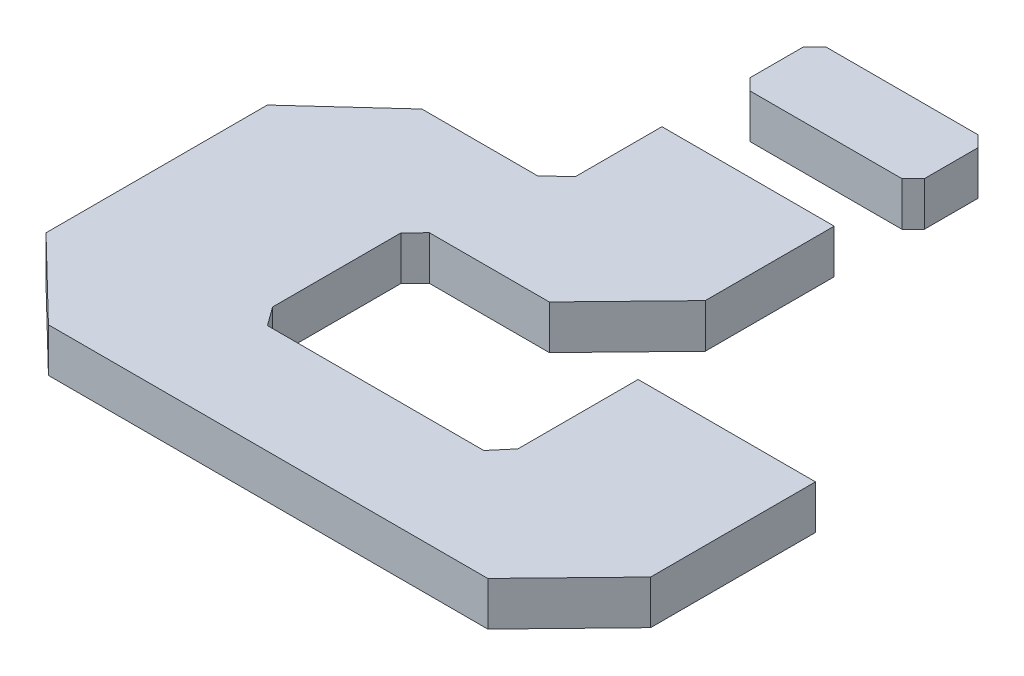
ISO-10303-21;
HEADER;
FILE_DESCRIPTION(('STEP AP214'),'2;1');
FILE_NAME('part.step','',(''),(''),'','','');
FILE_SCHEMA(('AUTOMOTIVE_DESIGN { 1 0 10303 214 1 1 1 1 }'));
ENDSEC;
DATA;
#1=APPLICATION_CONTEXT('core data for automotive mechanical design processes');
#2=APPLICATION_PROTOCOL_DEFINITION('international standard','automotive_design',2000,#1);
#3=PRODUCT_CONTEXT('',#1,'mechanical');
#4=PRODUCT('Part','Part','',(#3));
#5=PRODUCT_RELATED_PRODUCT_CATEGORY('part','',(#4));
#6=PRODUCT_DEFINITION_FORMATION('','',#4);
#7=PRODUCT_DEFINITION_CONTEXT('part definition',#1,'design');
#8=PRODUCT_DEFINITION('design','',#6,#7);
#9=PRODUCT_DEFINITION_SHAPE('','',#8);
#10=(LENGTH_UNIT() NAMED_UNIT(*) SI_UNIT(.MILLI.,.METRE.));
#11=(NAMED_UNIT(*) PLANE_ANGLE_UNIT() SI_UNIT($,.RADIAN.));
#12=(NAMED_UNIT(*) SI_UNIT($,.STERADIAN.) SOLID_ANGLE_UNIT());
#13=UNCERTAINTY_MEASURE_WITH_UNIT(LENGTH_MEASURE(1.E-05),#10,'distance_accuracy_value','');
#14=(GEOMETRIC_REPRESENTATION_CONTEXT(3) GLOBAL_UNCERTAINTY_ASSIGNED_CONTEXT((#13)) GLOBAL_UNIT_ASSIGNED_CONTEXT((#10,
#11,#12)) REPRESENTATION_CONTEXT('',''));
#15=CARTESIAN_POINT('',(0.,0.,0.));
#16=DIRECTION('',(0.,0.,1.));
#17=DIRECTION('',(1.,0.,0.));
#18=AXIS2_PLACEMENT_3D('',#15,#16,#17);
#19=CARTESIAN_POINT('',(10.6393932182767,3.,-13.1965444015863));
#20=DIRECTION('',(0.,0.,-1.));
#21=DIRECTION('',(-1.,0.,0.));
#22=AXIS2_PLACEMENT_3D('',#19,#20,#21);
#23=PLANE('',#22);
#24=DIRECTION('',(1.,0.,0.));
#25=VECTOR('',#24,1.);
#26=CARTESIAN_POINT('',(10.6393932182767,0.,-13.1965444015863));
#27=LINE('',#26,#25);
#28=CARTESIAN_POINT('',(0.23435597339086,0.,-13.1965444015863));
#29=VERTEX_POINT('',#28);
#30=CARTESIAN_POINT('',(10.6393932182767,0.,-13.1965444015863));
#31=VERTEX_POINT('',#30);
#32=EDGE_CURVE('E141',#29,#31,#27,.T.);
#33=ORIENTED_EDGE('',*,*,#32,.T.);
#34=DIRECTION('',(0.,-1.,0.));
#35=VECTOR('',#34,1.);
#36=CARTESIAN_POINT('',(10.6393932182767,3.,-13.1965444015863));
#37=LINE('',#36,#35);
#38=CARTESIAN_POINT('',(10.6393932182767,3.,-13.1965444015863));
#39=VERTEX_POINT('',#38);
#40=EDGE_CURVE('E12',#39,#31,#37,.T.);
#41=ORIENTED_EDGE('',*,*,#40,.F.);
#42=DIRECTION('',(1.,0.,0.));
#43=VECTOR('',#42,1.);
#44=CARTESIAN_POINT('',(10.6393932182767,3.,-13.1965444015863));
#45=LINE('',#44,#43);
#46=CARTESIAN_POINT('',(0.23435597339086,3.,-13.1965444015863));
#47=VERTEX_POINT('',#46);
#48=EDGE_CURVE('E155',#47,#39,#45,.T.);
#49=ORIENTED_EDGE('',*,*,#48,.F.);
#50=DIRECTION('',(0.,-1.,0.));
#51=VECTOR('',#50,1.);
#52=CARTESIAN_POINT('',(0.23435597339086,3.,-13.1965444015863));
#53=LINE('',#52,#51);
#54=EDGE_CURVE('E137',#47,#29,#53,.T.);
#55=ORIENTED_EDGE('',*,*,#54,.T.);
#56=EDGE_LOOP('',(#33,#41,#49,#55));
#57=FACE_BOUND('',#56,.T.);
#58=ADVANCED_FACE('F45',(#57),#23,.F.);
#59=CARTESIAN_POINT('',(10.6393932182767,3.,-13.1965444015863));
#60=DIRECTION('',(-0.707106781186548,0.,-0.707106781186548));
#61=DIRECTION('',(-0.707106781186548,0.,0.707106781186548));
#62=AXIS2_PLACEMENT_3D('',#59,#60,#61);
#63=PLANE('',#62);
#64=DIRECTION('',(0.707106781186547,0.,-0.707106781186547));
#65=VECTOR('',#64,1.);
#66=CARTESIAN_POINT('',(10.6393932182767,0.,-13.1965444015863));
#67=LINE('',#66,#65);
#68=CARTESIAN_POINT('',(11.405078643226,0.,-13.9622298265356));
#69=VERTEX_POINT('',#68);
#70=EDGE_CURVE('E144',#31,#69,#67,.T.);
#71=ORIENTED_EDGE('',*,*,#70,.T.);
#72=DIRECTION('',(0.,-1.,0.));
#73=VECTOR('',#72,1.);
#74=CARTESIAN_POINT('',(11.405078643226,3.,-13.9622298265356));
#75=LINE('',#74,#73);
#76=CARTESIAN_POINT('',(11.405078643226,3.,-13.9622298265356));
#77=VERTEX_POINT('',#76);
#78=EDGE_CURVE('E53',#77,#69,#75,.T.);
#79=ORIENTED_EDGE('',*,*,#78,.F.);
#80=DIRECTION('',(0.707106781186547,0.,-0.707106781186547));
#81=VECTOR('',#80,1.);
#82=CARTESIAN_POINT('',(10.6393932182767,3.,-13.1965444015863));
#83=LINE('',#82,#81);
#84=EDGE_CURVE('E104',#39,#77,#83,.T.);
#85=ORIENTED_EDGE('',*,*,#84,.F.);
#86=ORIENTED_EDGE('',*,*,#40,.T.);
#87=EDGE_LOOP('',(#71,#79,#85,#86));
#88=FACE_BOUND('',#87,.T.);
#89=ADVANCED_FACE('F190',(#88),#63,.F.);
#90=CARTESIAN_POINT('',(11.405078643226,3.,-13.9622298265356));
#91=DIRECTION('',(-1.,0.,0.));
#92=DIRECTION('',(0.,0.,1.));
#93=AXIS2_PLACEMENT_3D('',#90,#91,#92);
#94=PLANE('',#93);
#95=DIRECTION('',(0.,0.,-1.));
#96=VECTOR('',#95,1.);
#97=CARTESIAN_POINT('',(11.405078643226,0.,-13.9622298265356));
#98=LINE('',#97,#96);
#99=CARTESIAN_POINT('',(11.405078643226,0.,-17.6308589766371));
#100=VERTEX_POINT('',#99);
#101=EDGE_CURVE('E146',#69,#100,#98,.T.);
#102=ORIENTED_EDGE('',*,*,#101,.T.);
#103=DIRECTION('',(0.,-1.,0.));
#104=VECTOR('',#103,1.);
#105=CARTESIAN_POINT('',(11.405078643226,3.,-17.6308589766371));
#106=LINE('',#105,#104);
#107=CARTESIAN_POINT('',(11.405078643226,3.,-17.6308589766371));
#108=VERTEX_POINT('',#107);
#109=EDGE_CURVE('E162',#108,#100,#106,.T.);
#110=ORIENTED_EDGE('',*,*,#109,.F.);
#111=DIRECTION('',(0.,0.,-1.));
#112=VECTOR('',#111,1.);
#113=CARTESIAN_POINT('',(11.405078643226,3.,-13.9622298265356));
#114=LINE('',#113,#112);
#115=EDGE_CURVE('E170',#77,#108,#114,.T.);
#116=ORIENTED_EDGE('',*,*,#115,.F.);
#117=ORIENTED_EDGE('',*,*,#78,.T.);
#118=EDGE_LOOP('',(#102,#110,#116,#117));
#119=FACE_BOUND('',#118,.T.);
#120=ADVANCED_FACE('F168',(#119),#94,.F.);
#121=CARTESIAN_POINT('',(11.405078643226,3.,-17.6308589766371));
#122=DIRECTION('',(-0.707106781186548,0.,0.707106781186548));
#123=DIRECTION('',(0.707106781186548,0.,0.707106781186548));
#124=AXIS2_PLACEMENT_3D('',#121,#122,#123);
#125=PLANE('',#124);
#126=DIRECTION('',(-0.707106781186547,0.,-0.707106781186547));
#127=VECTOR('',#126,1.);
#128=CARTESIAN_POINT('',(11.405078643226,0.,-17.6308589766371));
#129=LINE('',#128,#127);
#130=CARTESIAN_POINT('',(10.6393932182767,0.,-18.3965444015863));
#131=VERTEX_POINT('',#130);
#132=EDGE_CURVE('E148',#100,#131,#129,.T.);
#133=ORIENTED_EDGE('',*,*,#132,.T.);
#134=DIRECTION('',(0.,-1.,0.));
#135=VECTOR('',#134,1.);
#136=CARTESIAN_POINT('',(10.6393932182767,3.,-18.3965444015863));
#137=LINE('',#136,#135);
#138=CARTESIAN_POINT('',(10.6393932182767,3.,-18.3965444015863));
#139=VERTEX_POINT('',#138);
#140=EDGE_CURVE('E159',#139,#131,#137,.T.);
#141=ORIENTED_EDGE('',*,*,#140,.F.);
#142=DIRECTION('',(-0.707106781186547,0.,-0.707106781186547));
#143=VECTOR('',#142,1.);
#144=CARTESIAN_POINT('',(11.405078643226,3.,-17.6308589766371));
#145=LINE('',#144,#143);
#146=EDGE_CURVE('E182',#108,#139,#145,.T.);
#147=ORIENTED_EDGE('',*,*,#146,.F.);
#148=ORIENTED_EDGE('',*,*,#109,.T.);
#149=EDGE_LOOP('',(#133,#141,#147,#148));
#150=FACE_BOUND('',#149,.T.);
#151=ADVANCED_FACE('F178',(#150),#125,.F.);
#152=CARTESIAN_POINT('',(10.6393932182767,3.,-18.3965444015863));
#153=DIRECTION('',(0.,0.,1.));
#154=DIRECTION('',(1.,0.,0.));
#155=AXIS2_PLACEMENT_3D('',#152,#153,#154);
#156=PLANE('',#155);
#157=DIRECTION('',(-1.,0.,0.));
#158=VECTOR('',#157,1.);
#159=CARTESIAN_POINT('',(10.6393932182767,0.,-18.3965444015863));
#160=LINE('',#159,#158);
#161=CARTESIAN_POINT('',(0.234355973390866,0.,-18.3965444015863));
#162=VERTEX_POINT('',#161);
#163=EDGE_CURVE('E150',#131,#162,#160,.T.);
#164=ORIENTED_EDGE('',*,*,#163,.T.);
#165=DIRECTION('',(0.,-1.,0.));
#166=VECTOR('',#165,1.);
#167=CARTESIAN_POINT('',(0.234355973390866,3.,-18.3965444015863));
#168=LINE('',#167,#166);
#169=CARTESIAN_POINT('',(0.234355973390866,3.,-18.3965444015863));
#170=VERTEX_POINT('',#169);
#171=EDGE_CURVE('E132',#170,#162,#168,.T.);
#172=ORIENTED_EDGE('',*,*,#171,.F.);
#173=DIRECTION('',(-1.,0.,0.));
#174=VECTOR('',#173,1.);
#175=CARTESIAN_POINT('',(10.6393932182767,3.,-18.3965444015863));
#176=LINE('',#175,#174);
#177=EDGE_CURVE('E123',#139,#170,#176,.T.);
#178=ORIENTED_EDGE('',*,*,#177,.F.);
#179=ORIENTED_EDGE('',*,*,#140,.T.);
#180=EDGE_LOOP('',(#164,#172,#178,#179));
#181=FACE_BOUND('',#180,.T.);
#182=ADVANCED_FACE('F181',(#181),#156,.F.);
#183=CARTESIAN_POINT('',(-0.531329451558372,3.,-17.6308589766371));
#184=DIRECTION('',(0.707106781186547,0.,0.707106781186548));
#185=DIRECTION('',(0.707106781186548,0.,-0.707106781186547));
#186=AXIS2_PLACEMENT_3D('',#183,#184,#185);
#187=PLANE('',#186);
#188=DIRECTION('',(-0.707106781186548,0.,0.707106781186547));
#189=VECTOR('',#188,1.);
#190=CARTESIAN_POINT('',(-0.531329451558372,0.,-17.6308589766371));
#191=LINE('',#190,#189);
#192=CARTESIAN_POINT('',(-0.531329451558372,0.,-17.6308589766371));
#193=VERTEX_POINT('',#192);
#194=EDGE_CURVE('E131',#162,#193,#191,.T.);
#195=ORIENTED_EDGE('',*,*,#194,.T.);
#196=DIRECTION('',(0.,-1.,0.));
#197=VECTOR('',#196,1.);
#198=CARTESIAN_POINT('',(-0.531329451558372,3.,-17.6308589766371));
#199=LINE('',#198,#197);
#200=CARTESIAN_POINT('',(-0.531329451558372,3.,-17.6308589766371));
#201=VERTEX_POINT('',#200);
#202=EDGE_CURVE('E128',#201,#193,#199,.T.);
#203=ORIENTED_EDGE('',*,*,#202,.F.);
#204=DIRECTION('',(-0.707106781186548,0.,0.707106781186547));
#205=VECTOR('',#204,1.);
#206=CARTESIAN_POINT('',(-0.531329451558372,3.,-17.6308589766371));
#207=LINE('',#206,#205);
#208=EDGE_CURVE('E117',#170,#201,#207,.T.);
#209=ORIENTED_EDGE('',*,*,#208,.F.);
#210=ORIENTED_EDGE('',*,*,#171,.T.);
#211=EDGE_LOOP('',(#195,#203,#209,#210));
#212=FACE_BOUND('',#211,.T.);
#213=ADVANCED_FACE('F129',(#212),#187,.F.);
#214=CARTESIAN_POINT('',(-0.531329451558372,3.,-13.9622298265356));
#215=DIRECTION('',(1.,0.,0.));
#216=DIRECTION('',(0.,0.,-1.));
#217=AXIS2_PLACEMENT_3D('',#214,#215,#216);
#218=PLANE('',#217);
#219=DIRECTION('',(0.,0.,1.));
#220=VECTOR('',#219,1.);
#221=CARTESIAN_POINT('',(-0.531329451558372,0.,-13.9622298265356));
#222=LINE('',#221,#220);
#223=CARTESIAN_POINT('',(-0.531329451558372,0.,-13.9622298265356));
#224=VERTEX_POINT('',#223);
#225=EDGE_CURVE('E90',#193,#224,#222,.T.);
#226=ORIENTED_EDGE('',*,*,#225,.T.);
#227=DIRECTION('',(0.,-1.,0.));
#228=VECTOR('',#227,1.);
#229=CARTESIAN_POINT('',(-0.531329451558372,3.,-13.9622298265356));
#230=LINE('',#229,#228);
#231=CARTESIAN_POINT('',(-0.531329451558372,3.,-13.9622298265356));
#232=VERTEX_POINT('',#231);
#233=EDGE_CURVE('E133',#232,#224,#230,.T.);
#234=ORIENTED_EDGE('',*,*,#233,.F.);
#235=DIRECTION('',(0.,0.,1.));
#236=VECTOR('',#235,1.);
#237=CARTESIAN_POINT('',(-0.531329451558372,3.,-13.9622298265356));
#238=LINE('',#237,#236);
#239=EDGE_CURVE('E121',#201,#232,#238,.T.);
#240=ORIENTED_EDGE('',*,*,#239,.F.);
#241=ORIENTED_EDGE('',*,*,#202,.T.);
#242=EDGE_LOOP('',(#226,#234,#240,#241));
#243=FACE_BOUND('',#242,.T.);
#244=ADVANCED_FACE('F135',(#243),#218,.F.);
#245=CARTESIAN_POINT('',(0.23435597339086,3.,-13.1965444015863));
#246=DIRECTION('',(0.707106781186548,0.,-0.707106781186547));
#247=DIRECTION('',(-0.707106781186547,0.,-0.707106781186548));
#248=AXIS2_PLACEMENT_3D('',#245,#246,#247);
#249=PLANE('',#248);
#250=DIRECTION('',(0.707106781186547,0.,0.707106781186548));
#251=VECTOR('',#250,1.);
#252=CARTESIAN_POINT('',(0.23435597339086,0.,-13.1965444015863));
#253=LINE('',#252,#251);
#254=EDGE_CURVE('E96',#224,#29,#253,.T.);
#255=ORIENTED_EDGE('',*,*,#254,.T.);
#256=ORIENTED_EDGE('',*,*,#54,.F.);
#257=DIRECTION('',(0.707106781186547,0.,0.707106781186548));
#258=VECTOR('',#257,1.);
#259=CARTESIAN_POINT('',(0.23435597339086,3.,-13.1965444015863));
#260=LINE('',#259,#258);
#261=EDGE_CURVE('E61',#232,#47,#260,.T.);
#262=ORIENTED_EDGE('',*,*,#261,.F.);
#263=ORIENTED_EDGE('',*,*,#233,.T.);
#264=EDGE_LOOP('',(#255,#256,#262,#263));
#265=FACE_BOUND('',#264,.T.);
#266=ADVANCED_FACE('F206',(#265),#249,.F.);
#267=CARTESIAN_POINT('',(0.,3.,0.));
#268=DIRECTION('',(0.,-1.,0.));
#269=DIRECTION('',(0.,0.,-1.));
#270=AXIS2_PLACEMENT_3D('',#267,#268,#269);
#271=PLANE('',#270);
#272=ORIENTED_EDGE('',*,*,#48,.T.);
#273=ORIENTED_EDGE('',*,*,#84,.T.);
#274=ORIENTED_EDGE('',*,*,#115,.T.);
#275=ORIENTED_EDGE('',*,*,#146,.T.);
#276=ORIENTED_EDGE('',*,*,#177,.T.);
#277=ORIENTED_EDGE('',*,*,#208,.T.);
#278=ORIENTED_EDGE('',*,*,#239,.T.);
#279=ORIENTED_EDGE('',*,*,#261,.T.);
#280=EDGE_LOOP('',(#272,#273,#274,#275,#276,#277,#278,#279));
#281=FACE_BOUND('',#280,.T.);
#282=ADVANCED_FACE('F119',(#281),#271,.F.);
#283=CARTESIAN_POINT('',(0.,0.,0.));
#284=DIRECTION('',(0.,-1.,0.));
#285=DIRECTION('',(0.,0.,-1.));
#286=AXIS2_PLACEMENT_3D('',#283,#284,#285);
#287=PLANE('',#286);
#288=ORIENTED_EDGE('',*,*,#32,.F.);
#289=ORIENTED_EDGE('',*,*,#254,.F.);
#290=ORIENTED_EDGE('',*,*,#225,.F.);
#291=ORIENTED_EDGE('',*,*,#194,.F.);
#292=ORIENTED_EDGE('',*,*,#163,.F.);
#293=ORIENTED_EDGE('',*,*,#132,.F.);
#294=ORIENTED_EDGE('',*,*,#101,.F.);
#295=ORIENTED_EDGE('',*,*,#70,.F.);
#296=EDGE_LOOP('',(#288,#289,#290,#291,#292,#293,#294,#295));
#297=FACE_BOUND('',#296,.T.);
#298=ADVANCED_FACE('F174',(#297),#287,.T.);
#299=CLOSED_SHELL('',(#58,#89,#120,#151,#182,#213,#244,#266,#282,#298));
#300=MANIFOLD_SOLID_BREP('B2',#299);
#301=CARTESIAN_POINT('',(25.6375525568072,3.,18.9856204393091));
#302=DIRECTION('',(-0.717830007819958,0.,-0.696218413914196));
#303=DIRECTION('',(-0.696218413914196,0.,0.717830007819958));
#304=AXIS2_PLACEMENT_3D('',#301,#302,#303);
#305=PLANE('',#304);
#306=DIRECTION('',(0.696218413914196,0.,-0.717830007819958));
#307=VECTOR('',#306,1.);
#308=CARTESIAN_POINT('',(25.6375525568072,0.,18.9856204393091));
#309=LINE('',#308,#307);
#310=CARTESIAN_POINT('',(20.1544370115917,0.,24.6389395645122));
#311=VERTEX_POINT('',#310);
#312=CARTESIAN_POINT('',(25.6375525568072,0.,18.9856204393091));
#313=VERTEX_POINT('',#312);
#314=EDGE_CURVE('E441',#311,#313,#309,.T.);
#315=ORIENTED_EDGE('',*,*,#314,.T.);
#316=DIRECTION('',(0.,-1.,0.));
#317=VECTOR('',#316,1.);
#318=CARTESIAN_POINT('',(25.6375525568072,3.,18.9856204393091));
#319=LINE('',#318,#317);
#320=CARTESIAN_POINT('',(25.6375525568072,3.,18.9856204393091));
#321=VERTEX_POINT('',#320);
#322=EDGE_CURVE('E43',#321,#313,#319,.T.);
#323=ORIENTED_EDGE('',*,*,#322,.F.);
#324=DIRECTION('',(0.696218413914196,0.,-0.717830007819958));
#325=VECTOR('',#324,1.);
#326=CARTESIAN_POINT('',(25.6375525568072,3.,18.9856204393091));
#327=LINE('',#326,#325);
#328=CARTESIAN_POINT('',(20.1544370115917,3.,24.6389395645122));
#329=VERTEX_POINT('',#328);
#330=EDGE_CURVE('E479',#329,#321,#327,.T.);
#331=ORIENTED_EDGE('',*,*,#330,.F.);
#332=DIRECTION('',(0.,-1.,0.));
#333=VECTOR('',#332,1.);
#334=CARTESIAN_POINT('',(20.1544370115917,3.,24.6389395645122));
#335=LINE('',#334,#333);
#336=EDGE_CURVE('E437',#329,#311,#335,.T.);
#337=ORIENTED_EDGE('',*,*,#336,.T.);
#338=EDGE_LOOP('',(#315,#323,#331,#337));
#339=FACE_BOUND('',#338,.T.);
#340=ADVANCED_FACE('F273',(#339),#305,.F.);
#341=CARTESIAN_POINT('',(25.6375525568072,3.,18.9856204393091));
#342=DIRECTION('',(-1.,0.,0.));
#343=DIRECTION('',(0.,0.,1.));
#344=AXIS2_PLACEMENT_3D('',#341,#342,#343);
#345=PLANE('',#344);
#346=DIRECTION('',(0.,0.,-1.));
#347=VECTOR('',#346,1.);
#348=CARTESIAN_POINT('',(25.6375525568072,0.,18.9856204393091));
#349=LINE('',#348,#347);
#350=CARTESIAN_POINT('',(25.6375525568072,0.,7.71461634316782));
#351=VERTEX_POINT('',#350);
#352=EDGE_CURVE('E444',#313,#351,#349,.T.);
#353=ORIENTED_EDGE('',*,*,#352,.T.);
#354=DIRECTION('',(0.,-1.,0.));
#355=VECTOR('',#354,1.);
#356=CARTESIAN_POINT('',(25.6375525568072,3.,7.71461634316782));
#357=LINE('',#356,#355);
#358=CARTESIAN_POINT('',(25.6375525568072,3.,7.71461634316782));
#359=VERTEX_POINT('',#358);
#360=EDGE_CURVE('E281',#359,#351,#357,.T.);
#361=ORIENTED_EDGE('',*,*,#360,.F.);
#362=DIRECTION('',(0.,0.,-1.));
#363=VECTOR('',#362,1.);
#364=CARTESIAN_POINT('',(25.6375525568072,3.,18.9856204393091));
#365=LINE('',#364,#363);
#366=EDGE_CURVE('E368',#321,#359,#365,.T.);
#367=ORIENTED_EDGE('',*,*,#366,.F.);
#368=ORIENTED_EDGE('',*,*,#322,.T.);
#369=EDGE_LOOP('',(#353,#361,#367,#368));
#370=FACE_BOUND('',#369,.T.);
#371=ADVANCED_FACE('F597',(#370),#345,.F.);
#372=CARTESIAN_POINT('',(25.6375525568072,3.,7.71461634316782));
#373=DIRECTION('',(0.,0.,1.));
#374=DIRECTION('',(1.,0.,0.));
#375=AXIS2_PLACEMENT_3D('',#372,#373,#374);
#376=PLANE('',#375);
#377=DIRECTION('',(-1.,0.,0.));
#378=VECTOR('',#377,1.);
#379=CARTESIAN_POINT('',(25.6375525568072,0.,7.71461634316782));
#380=LINE('',#379,#378);
#381=CARTESIAN_POINT('',(13.5104667001218,0.,7.71461634316782));
#382=VERTEX_POINT('',#381);
#383=EDGE_CURVE('E446',#351,#382,#380,.T.);
#384=ORIENTED_EDGE('',*,*,#383,.T.);
#385=DIRECTION('',(0.,-1.,0.));
#386=VECTOR('',#385,1.);
#387=CARTESIAN_POINT('',(13.5104667001218,3.,7.71461634316782));
#388=LINE('',#387,#386);
#389=CARTESIAN_POINT('',(13.5104667001218,3.,7.71461634316782));
#390=VERTEX_POINT('',#389);
#391=EDGE_CURVE('E522',#390,#382,#388,.T.);
#392=ORIENTED_EDGE('',*,*,#391,.F.);
#393=DIRECTION('',(-1.,0.,0.));
#394=VECTOR('',#393,1.);
#395=CARTESIAN_POINT('',(25.6375525568072,3.,7.71461634316782));
#396=LINE('',#395,#394);
#397=EDGE_CURVE('E530',#359,#390,#396,.T.);
#398=ORIENTED_EDGE('',*,*,#397,.F.);
#399=ORIENTED_EDGE('',*,*,#360,.T.);
#400=EDGE_LOOP('',(#384,#392,#398,#399));
#401=FACE_BOUND('',#400,.T.);
#402=ADVANCED_FACE('F528',(#401),#376,.F.);
#403=CARTESIAN_POINT('',(13.5104667001218,3.,15.9377568482358));
#404=DIRECTION('',(1.,0.,0.));
#405=DIRECTION('',(0.,0.,-1.));
#406=AXIS2_PLACEMENT_3D('',#403,#404,#405);
#407=PLANE('',#406);
#408=DIRECTION('',(0.,0.,1.));
#409=VECTOR('',#408,1.);
#410=CARTESIAN_POINT('',(13.5104667001218,0.,15.9377568482358));
#411=LINE('',#410,#409);
#412=CARTESIAN_POINT('',(13.5104667001218,0.,15.9377568482358));
#413=VERTEX_POINT('',#412);
#414=EDGE_CURVE('E448',#382,#413,#411,.T.);
#415=ORIENTED_EDGE('',*,*,#414,.T.);
#416=DIRECTION('',(0.,-1.,0.));
#417=VECTOR('',#416,1.);
#418=CARTESIAN_POINT('',(13.5104667001218,3.,15.9377568482358));
#419=LINE('',#418,#417);
#420=CARTESIAN_POINT('',(13.5104667001218,3.,15.9377568482358));
#421=VERTEX_POINT('',#420);
#422=EDGE_CURVE('E519',#421,#413,#419,.T.);
#423=ORIENTED_EDGE('',*,*,#422,.F.);
#424=DIRECTION('',(0.,0.,1.));
#425=VECTOR('',#424,1.);
#426=CARTESIAN_POINT('',(13.5104667001218,3.,15.9377568482358));
#427=LINE('',#426,#425);
#428=EDGE_CURVE('E548',#390,#421,#427,.T.);
#429=ORIENTED_EDGE('',*,*,#428,.F.);
#430=ORIENTED_EDGE('',*,*,#391,.T.);
#431=EDGE_LOOP('',(#415,#423,#429,#430));
#432=FACE_BOUND('',#431,.T.);
#433=ADVANCED_FACE('F539',(#432),#407,.F.);
#434=CARTESIAN_POINT('',(12.4418829016683,3.,17.1975666306473));
#435=DIRECTION('',(0.762612366116517,0.,0.64685576371102));
#436=DIRECTION('',(0.64685576371102,0.,-0.762612366116517));
#437=AXIS2_PLACEMENT_3D('',#434,#435,#436);
#438=PLANE('',#437);
#439=DIRECTION('',(-0.64685576371102,0.,0.762612366116517));
#440=VECTOR('',#439,1.);
#441=CARTESIAN_POINT('',(12.4418829016683,0.,17.1975666306473));
#442=LINE('',#441,#440);
#443=CARTESIAN_POINT('',(12.4418829016683,0.,17.1975666306473));
#444=VERTEX_POINT('',#443);
#445=EDGE_CURVE('E450',#413,#444,#442,.T.);
#446=ORIENTED_EDGE('',*,*,#445,.T.);
#447=DIRECTION('',(0.,-1.,0.));
#448=VECTOR('',#447,1.);
#449=CARTESIAN_POINT('',(12.4418829016683,3.,17.1975666306473));
#450=LINE('',#449,#448);
#451=CARTESIAN_POINT('',(12.4418829016683,3.,17.1975666306473));
#452=VERTEX_POINT('',#451);
#453=EDGE_CURVE('E516',#452,#444,#450,.T.);
#454=ORIENTED_EDGE('',*,*,#453,.F.);
#455=DIRECTION('',(-0.64685576371102,0.,0.762612366116517));
#456=VECTOR('',#455,1.);
#457=CARTESIAN_POINT('',(12.4418829016683,3.,17.1975666306473));
#458=LINE('',#457,#456);
#459=EDGE_CURVE('E545',#421,#452,#458,.T.);
#460=ORIENTED_EDGE('',*,*,#459,.F.);
#461=ORIENTED_EDGE('',*,*,#422,.T.);
#462=EDGE_LOOP('',(#446,#454,#460,#461));
#463=FACE_BOUND('',#462,.T.);
#464=ADVANCED_FACE('F543',(#463),#438,.F.);
#465=CARTESIAN_POINT('',(-2.35330466007292,3.,17.1975666306473));
#466=DIRECTION('',(0.,0.,1.));
#467=DIRECTION('',(1.,0.,0.));
#468=AXIS2_PLACEMENT_3D('',#465,#466,#467);
#469=PLANE('',#468);
#470=DIRECTION('',(-1.,0.,0.));
#471=VECTOR('',#470,1.);
#472=CARTESIAN_POINT('',(-2.35330466007292,0.,17.1975666306473));
#473=LINE('',#472,#471);
#474=CARTESIAN_POINT('',(-2.35330466007292,0.,17.1975666306473));
#475=VERTEX_POINT('',#474);
#476=EDGE_CURVE('E452',#444,#475,#473,.T.);
#477=ORIENTED_EDGE('',*,*,#476,.T.);
#478=DIRECTION('',(0.,-1.,0.));
#479=VECTOR('',#478,1.);
#480=CARTESIAN_POINT('',(-2.35330466007292,3.,17.1975666306473));
#481=LINE('',#480,#479);
#482=CARTESIAN_POINT('',(-2.35330466007292,3.,17.1975666306473));
#483=VERTEX_POINT('',#482);
#484=EDGE_CURVE('E513',#483,#475,#481,.T.);
#485=ORIENTED_EDGE('',*,*,#484,.F.);
#486=DIRECTION('',(-1.,0.,0.));
#487=VECTOR('',#486,1.);
#488=CARTESIAN_POINT('',(-2.35330466007292,3.,17.1975666306473));
#489=LINE('',#488,#487);
#490=EDGE_CURVE('E547',#452,#483,#489,.T.);
#491=ORIENTED_EDGE('',*,*,#490,.F.);
#492=ORIENTED_EDGE('',*,*,#453,.T.);
#493=EDGE_LOOP('',(#477,#485,#491,#492));
#494=FACE_BOUND('',#493,.T.);
#495=ADVANCED_FACE('F610',(#494),#469,.F.);
#496=CARTESIAN_POINT('',(-3.27912840988501,3.,15.9207189665832));
#497=DIRECTION('',(-0.809577541370331,0.,0.58701295088675));
#498=DIRECTION('',(0.58701295088675,0.,0.809577541370331));
#499=AXIS2_PLACEMENT_3D('',#496,#497,#498);
#500=PLANE('',#499);
#501=DIRECTION('',(-0.58701295088675,0.,-0.809577541370331));
#502=VECTOR('',#501,1.);
#503=CARTESIAN_POINT('',(-3.27912840988501,0.,15.9207189665832));
#504=LINE('',#503,#502);
#505=CARTESIAN_POINT('',(-3.27912840988501,0.,15.9207189665832));
#506=VERTEX_POINT('',#505);
#507=EDGE_CURVE('E454',#475,#506,#504,.T.);
#508=ORIENTED_EDGE('',*,*,#507,.T.);
#509=DIRECTION('',(0.,-1.,0.));
#510=VECTOR('',#509,1.);
#511=CARTESIAN_POINT('',(-3.27912840988501,3.,15.9207189665832));
#512=LINE('',#511,#510);
#513=CARTESIAN_POINT('',(-3.27912840988501,3.,15.9207189665832));
#514=VERTEX_POINT('',#513);
#515=EDGE_CURVE('E510',#514,#506,#512,.T.);
#516=ORIENTED_EDGE('',*,*,#515,.F.);
#517=DIRECTION('',(-0.58701295088675,0.,-0.809577541370331));
#518=VECTOR('',#517,1.);
#519=CARTESIAN_POINT('',(-3.27912840988501,3.,15.9207189665832));
#520=LINE('',#519,#518);
#521=EDGE_CURVE('E550',#483,#514,#520,.T.);
#522=ORIENTED_EDGE('',*,*,#521,.F.);
#523=ORIENTED_EDGE('',*,*,#484,.T.);
#524=EDGE_LOOP('',(#508,#516,#522,#523));
#525=FACE_BOUND('',#524,.T.);
#526=ADVANCED_FACE('F613',(#525),#500,.F.);
#527=CARTESIAN_POINT('',(-3.27912840988501,3.,7.15250055505262));
#528=DIRECTION('',(-1.,0.,0.));
#529=DIRECTION('',(0.,0.,1.));
#530=AXIS2_PLACEMENT_3D('',#527,#528,#529);
#531=PLANE('',#530);
#532=DIRECTION('',(0.,0.,-1.));
#533=VECTOR('',#532,1.);
#534=CARTESIAN_POINT('',(-3.27912840988501,0.,7.15250055505262));
#535=LINE('',#534,#533);
#536=CARTESIAN_POINT('',(-3.27912840988501,0.,7.15250055505262));
#537=VERTEX_POINT('',#536);
#538=EDGE_CURVE('E456',#506,#537,#535,.T.);
#539=ORIENTED_EDGE('',*,*,#538,.T.);
#540=DIRECTION('',(0.,-1.,0.));
#541=VECTOR('',#540,1.);
#542=CARTESIAN_POINT('',(-3.27912840988501,3.,7.15250055505262));
#543=LINE('',#542,#541);
#544=CARTESIAN_POINT('',(-3.27912840988501,3.,7.15250055505262));
#545=VERTEX_POINT('',#544);
#546=EDGE_CURVE('E507',#545,#537,#543,.T.);
#547=ORIENTED_EDGE('',*,*,#546,.F.);
#548=DIRECTION('',(0.,0.,-1.));
#549=VECTOR('',#548,1.);
#550=CARTESIAN_POINT('',(-3.27912840988501,3.,7.15250055505262));
#551=LINE('',#550,#549);
#552=EDGE_CURVE('E556',#514,#545,#551,.T.);
#553=ORIENTED_EDGE('',*,*,#552,.F.);
#554=ORIENTED_EDGE('',*,*,#515,.T.);
#555=EDGE_LOOP('',(#539,#547,#553,#554));
#556=FACE_BOUND('',#555,.T.);
#557=ADVANCED_FACE('F617',(#556),#531,.F.);
#558=CARTESIAN_POINT('',(-2.31853174514346,3.,6.16208562550978));
#559=DIRECTION('',(-0.71783000781996,0.,-0.696218413914194));
#560=DIRECTION('',(-0.696218413914195,0.,0.71783000781996));
#561=AXIS2_PLACEMENT_3D('',#558,#559,#560);
#562=PLANE('',#561);
#563=DIRECTION('',(0.696218413914195,0.,-0.71783000781996));
#564=VECTOR('',#563,1.);
#565=CARTESIAN_POINT('',(-2.31853174514346,0.,6.16208562550978));
#566=LINE('',#565,#564);
#567=CARTESIAN_POINT('',(-2.31853174514346,0.,6.16208562550978));
#568=VERTEX_POINT('',#567);
#569=EDGE_CURVE('E458',#537,#568,#566,.T.);
#570=ORIENTED_EDGE('',*,*,#569,.T.);
#571=DIRECTION('',(0.,-1.,0.));
#572=VECTOR('',#571,1.);
#573=CARTESIAN_POINT('',(-2.31853174514346,3.,6.16208562550978));
#574=LINE('',#573,#572);
#575=CARTESIAN_POINT('',(-2.31853174514346,3.,6.16208562550978));
#576=VERTEX_POINT('',#575);
#577=EDGE_CURVE('E504',#576,#568,#574,.T.);
#578=ORIENTED_EDGE('',*,*,#577,.F.);
#579=DIRECTION('',(0.696218413914195,0.,-0.71783000781996));
#580=VECTOR('',#579,1.);
#581=CARTESIAN_POINT('',(-2.31853174514346,3.,6.16208562550978));
#582=LINE('',#581,#580);
#583=EDGE_CURVE('E558',#545,#576,#582,.T.);
#584=ORIENTED_EDGE('',*,*,#583,.F.);
#585=ORIENTED_EDGE('',*,*,#546,.T.);
#586=EDGE_LOOP('',(#570,#578,#584,#585));
#587=FACE_BOUND('',#586,.T.);
#588=ADVANCED_FACE('F621',(#587),#562,.F.);
#589=CARTESIAN_POINT('',(5.88601442333204,3.,6.16208562550978));
#590=DIRECTION('',(0.,0.,-1.));
#591=DIRECTION('',(-1.,0.,0.));
#592=AXIS2_PLACEMENT_3D('',#589,#590,#591);
#593=PLANE('',#592);
#594=DIRECTION('',(1.,0.,0.));
#595=VECTOR('',#594,1.);
#596=CARTESIAN_POINT('',(5.88601442333204,0.,6.16208562550978));
#597=LINE('',#596,#595);
#598=CARTESIAN_POINT('',(5.88601442333204,0.,6.16208562550978));
#599=VERTEX_POINT('',#598);
#600=EDGE_CURVE('E460',#568,#599,#597,.T.);
#601=ORIENTED_EDGE('',*,*,#600,.T.);
#602=DIRECTION('',(0.,-1.,0.));
#603=VECTOR('',#602,1.);
#604=CARTESIAN_POINT('',(5.88601442333204,3.,6.16208562550978));
#605=LINE('',#604,#603);
#606=CARTESIAN_POINT('',(5.88601442333204,3.,6.16208562550978));
#607=VERTEX_POINT('',#606);
#608=EDGE_CURVE('E501',#607,#599,#605,.T.);
#609=ORIENTED_EDGE('',*,*,#608,.F.);
#610=DIRECTION('',(1.,0.,0.));
#611=VECTOR('',#610,1.);
#612=CARTESIAN_POINT('',(5.88601442333204,3.,6.16208562550978));
#613=LINE('',#612,#611);
#614=EDGE_CURVE('E560',#576,#607,#613,.T.);
#615=ORIENTED_EDGE('',*,*,#614,.F.);
#616=ORIENTED_EDGE('',*,*,#577,.T.);
#617=EDGE_LOOP('',(#601,#609,#615,#616));
#618=FACE_BOUND('',#617,.T.);
#619=ADVANCED_FACE('F625',(#618),#593,.F.);
#620=CARTESIAN_POINT('',(11.1357433735178,3.,0.749397741863903));
#621=DIRECTION('',(-0.717830007819958,0.,-0.696218413914196));
#622=DIRECTION('',(-0.696218413914196,0.,0.717830007819958));
#623=AXIS2_PLACEMENT_3D('',#620,#621,#622);
#624=PLANE('',#623);
#625=DIRECTION('',(0.696218413914196,0.,-0.717830007819958));
#626=VECTOR('',#625,1.);
#627=CARTESIAN_POINT('',(11.1357433735178,0.,0.749397741863903));
#628=LINE('',#627,#626);
#629=CARTESIAN_POINT('',(11.1357433735178,0.,0.749397741863903));
#630=VERTEX_POINT('',#629);
#631=EDGE_CURVE('E462',#599,#630,#628,.T.);
#632=ORIENTED_EDGE('',*,*,#631,.T.);
#633=DIRECTION('',(0.,-1.,0.));
#634=VECTOR('',#633,1.);
#635=CARTESIAN_POINT('',(11.1357433735178,3.,0.749397741863903));
#636=LINE('',#635,#634);
#637=CARTESIAN_POINT('',(11.1357433735178,3.,0.749397741863903));
#638=VERTEX_POINT('',#637);
#639=EDGE_CURVE('E498',#638,#630,#636,.T.);
#640=ORIENTED_EDGE('',*,*,#639,.F.);
#641=DIRECTION('',(0.696218413914196,0.,-0.717830007819958));
#642=VECTOR('',#641,1.);
#643=CARTESIAN_POINT('',(11.1357433735178,3.,0.749397741863903));
#644=LINE('',#643,#642);
#645=EDGE_CURVE('E562',#607,#638,#644,.T.);
#646=ORIENTED_EDGE('',*,*,#645,.F.);
#647=ORIENTED_EDGE('',*,*,#608,.T.);
#648=EDGE_LOOP('',(#632,#640,#646,#647));
#649=FACE_BOUND('',#648,.T.);
#650=ADVANCED_FACE('F629',(#649),#624,.F.);
#651=CARTESIAN_POINT('',(11.1357433735178,3.,-8.06815078911985));
#652=DIRECTION('',(-1.,0.,0.));
#653=DIRECTION('',(0.,0.,1.));
#654=AXIS2_PLACEMENT_3D('',#651,#652,#653);
#655=PLANE('',#654);
#656=DIRECTION('',(0.,0.,-1.));
#657=VECTOR('',#656,1.);
#658=CARTESIAN_POINT('',(11.1357433735178,0.,-8.06815078911985));
#659=LINE('',#658,#657);
#660=CARTESIAN_POINT('',(11.1357433735178,0.,-8.06815078911985));
#661=VERTEX_POINT('',#660);
#662=EDGE_CURVE('E464',#630,#661,#659,.T.);
#663=ORIENTED_EDGE('',*,*,#662,.T.);
#664=DIRECTION('',(0.,-1.,0.));
#665=VECTOR('',#664,1.);
#666=CARTESIAN_POINT('',(11.1357433735178,3.,-8.06815078911985));
#667=LINE('',#666,#665);
#668=CARTESIAN_POINT('',(11.1357433735178,3.,-8.06815078911985));
#669=VERTEX_POINT('',#668);
#670=EDGE_CURVE('E495',#669,#661,#667,.T.);
#671=ORIENTED_EDGE('',*,*,#670,.F.);
#672=DIRECTION('',(0.,0.,-1.));
#673=VECTOR('',#672,1.);
#674=CARTESIAN_POINT('',(11.1357433735178,3.,-8.06815078911985));
#675=LINE('',#674,#673);
#676=EDGE_CURVE('E564',#638,#669,#675,.T.);
#677=ORIENTED_EDGE('',*,*,#676,.F.);
#678=ORIENTED_EDGE('',*,*,#639,.T.);
#679=EDGE_LOOP('',(#663,#671,#677,#678));
#680=FACE_BOUND('',#679,.T.);
#681=ADVANCED_FACE('F633',(#680),#655,.F.);
#682=CARTESIAN_POINT('',(-0.644307785457188,3.,-8.06815078911985));
#683=DIRECTION('',(0.,0.,1.));
#684=DIRECTION('',(1.,0.,0.));
#685=AXIS2_PLACEMENT_3D('',#682,#683,#684);
#686=PLANE('',#685);
#687=DIRECTION('',(-1.,0.,0.));
#688=VECTOR('',#687,1.);
#689=CARTESIAN_POINT('',(-0.644307785457188,0.,-8.06815078911985));
#690=LINE('',#689,#688);
#691=CARTESIAN_POINT('',(-0.644307785457188,0.,-8.06815078911985));
#692=VERTEX_POINT('',#691);
#693=EDGE_CURVE('E466',#661,#692,#690,.T.);
#694=ORIENTED_EDGE('',*,*,#693,.T.);
#695=DIRECTION('',(0.,-1.,0.));
#696=VECTOR('',#695,1.);
#697=CARTESIAN_POINT('',(-0.644307785457188,3.,-8.06815078911985));
#698=LINE('',#697,#696);
#699=CARTESIAN_POINT('',(-0.644307785457188,3.,-8.06815078911985));
#700=VERTEX_POINT('',#699);
#701=EDGE_CURVE('E492',#700,#692,#698,.T.);
#702=ORIENTED_EDGE('',*,*,#701,.F.);
#703=DIRECTION('',(-1.,0.,0.));
#704=VECTOR('',#703,1.);
#705=CARTESIAN_POINT('',(-0.644307785457188,3.,-8.06815078911985));
#706=LINE('',#705,#704);
#707=EDGE_CURVE('E566',#669,#700,#706,.T.);
#708=ORIENTED_EDGE('',*,*,#707,.F.);
#709=ORIENTED_EDGE('',*,*,#670,.T.);
#710=EDGE_LOOP('',(#694,#702,#708,#709));
#711=FACE_BOUND('',#710,.T.);
#712=ADVANCED_FACE('F637',(#711),#686,.F.);
#713=CARTESIAN_POINT('',(-0.644307785457188,3.,-2.1401469063324));
#714=DIRECTION('',(1.,0.,0.));
#715=DIRECTION('',(0.,0.,-1.));
#716=AXIS2_PLACEMENT_3D('',#713,#714,#715);
#717=PLANE('',#716);
#718=DIRECTION('',(0.,0.,1.));
#719=VECTOR('',#718,1.);
#720=CARTESIAN_POINT('',(-0.644307785457188,0.,-2.1401469063324));
#721=LINE('',#720,#719);
#722=CARTESIAN_POINT('',(-0.644307785457188,0.,-2.1401469063324));
#723=VERTEX_POINT('',#722);
#724=EDGE_CURVE('E468',#692,#723,#721,.T.);
#725=ORIENTED_EDGE('',*,*,#724,.T.);
#726=DIRECTION('',(0.,-1.,0.));
#727=VECTOR('',#726,1.);
#728=CARTESIAN_POINT('',(-0.644307785457188,3.,-2.1401469063324));
#729=LINE('',#728,#727);
#730=CARTESIAN_POINT('',(-0.644307785457188,3.,-2.1401469063324));
#731=VERTEX_POINT('',#730);
#732=EDGE_CURVE('E489',#731,#723,#729,.T.);
#733=ORIENTED_EDGE('',*,*,#732,.F.);
#734=DIRECTION('',(0.,0.,1.));
#735=VECTOR('',#734,1.);
#736=CARTESIAN_POINT('',(-0.644307785457188,3.,-2.1401469063324));
#737=LINE('',#736,#735);
#738=EDGE_CURVE('E568',#700,#731,#737,.T.);
#739=ORIENTED_EDGE('',*,*,#738,.F.);
#740=ORIENTED_EDGE('',*,*,#701,.T.);
#741=EDGE_LOOP('',(#725,#733,#739,#740));
#742=FACE_BOUND('',#741,.T.);
#743=ADVANCED_FACE('F641',(#742),#717,.F.);
#744=CARTESIAN_POINT('',(-1.99401685297054,3.,-0.906752879612717));
#745=DIRECTION('',(0.674582780238092,0.,0.738199209296681));
#746=DIRECTION('',(0.738199209296681,0.,-0.674582780238092));
#747=AXIS2_PLACEMENT_3D('',#744,#745,#746);
#748=PLANE('',#747);
#749=DIRECTION('',(-0.738199209296681,0.,0.674582780238093));
#750=VECTOR('',#749,1.);
#751=CARTESIAN_POINT('',(-1.99401685297054,0.,-0.906752879612717));
#752=LINE('',#751,#750);
#753=CARTESIAN_POINT('',(-1.99401685297054,0.,-0.906752879612717));
#754=VERTEX_POINT('',#753);
#755=EDGE_CURVE('E470',#723,#754,#752,.T.);
#756=ORIENTED_EDGE('',*,*,#755,.T.);
#757=DIRECTION('',(0.,-1.,0.));
#758=VECTOR('',#757,1.);
#759=CARTESIAN_POINT('',(-1.99401685297054,3.,-0.906752879612717));
#760=LINE('',#759,#758);
#761=CARTESIAN_POINT('',(-1.99401685297054,3.,-0.906752879612717));
#762=VERTEX_POINT('',#761);
#763=EDGE_CURVE('E486',#762,#754,#760,.T.);
#764=ORIENTED_EDGE('',*,*,#763,.F.);
#765=DIRECTION('',(-0.738199209296681,0.,0.674582780238093));
#766=VECTOR('',#765,1.);
#767=CARTESIAN_POINT('',(-1.99401685297054,3.,-0.906752879612717));
#768=LINE('',#767,#766);
#769=EDGE_CURVE('E570',#731,#762,#768,.T.);
#770=ORIENTED_EDGE('',*,*,#769,.F.);
#771=ORIENTED_EDGE('',*,*,#732,.T.);
#772=EDGE_LOOP('',(#756,#764,#770,#771));
#773=FACE_BOUND('',#772,.T.);
#774=ADVANCED_FACE('F645',(#773),#748,.F.);
#775=CARTESIAN_POINT('',(-9.89497745823238,3.,-0.906752879612717));
#776=DIRECTION('',(0.,0.,1.));
#777=DIRECTION('',(1.,0.,0.));
#778=AXIS2_PLACEMENT_3D('',#775,#776,#777);
#779=PLANE('',#778);
#780=DIRECTION('',(-1.,0.,0.));
#781=VECTOR('',#780,1.);
#782=CARTESIAN_POINT('',(-9.89497745823238,0.,-0.906752879612717));
#783=LINE('',#782,#781);
#784=CARTESIAN_POINT('',(-9.89497745823238,0.,-0.906752879612717));
#785=VERTEX_POINT('',#784);
#786=EDGE_CURVE('E472',#754,#785,#783,.T.);
#787=ORIENTED_EDGE('',*,*,#786,.T.);
#788=DIRECTION('',(0.,-1.,0.));
#789=VECTOR('',#788,1.);
#790=CARTESIAN_POINT('',(-9.89497745823238,3.,-0.906752879612717));
#791=LINE('',#790,#789);
#792=CARTESIAN_POINT('',(-9.89497745823238,3.,-0.906752879612717));
#793=VERTEX_POINT('',#792);
#794=EDGE_CURVE('E483',#793,#785,#791,.T.);
#795=ORIENTED_EDGE('',*,*,#794,.F.);
#796=DIRECTION('',(-1.,0.,0.));
#797=VECTOR('',#796,1.);
#798=CARTESIAN_POINT('',(-9.89497745823238,3.,-0.906752879612717));
#799=LINE('',#798,#797);
#800=EDGE_CURVE('E572',#762,#793,#799,.T.);
#801=ORIENTED_EDGE('',*,*,#800,.F.);
#802=ORIENTED_EDGE('',*,*,#763,.T.);
#803=EDGE_LOOP('',(#787,#795,#801,#802));
#804=FACE_BOUND('',#803,.T.);
#805=ADVANCED_FACE('F578',(#804),#779,.F.);
#806=CARTESIAN_POINT('',(-15.4187755686229,3.,4.14101612346084));
#807=DIRECTION('',(0.674582780238093,0.,0.738199209296681));
#808=DIRECTION('',(0.738199209296681,0.,-0.674582780238093));
#809=AXIS2_PLACEMENT_3D('',#806,#807,#808);
#810=PLANE('',#809);
#811=DIRECTION('',(-0.738199209296681,0.,0.674582780238093));
#812=VECTOR('',#811,1.);
#813=CARTESIAN_POINT('',(-15.4187755686229,0.,4.14101612346084));
#814=LINE('',#813,#812);
#815=CARTESIAN_POINT('',(-15.4187755686229,0.,4.14101612346084));
#816=VERTEX_POINT('',#815);
#817=EDGE_CURVE('E474',#785,#816,#814,.T.);
#818=ORIENTED_EDGE('',*,*,#817,.T.);
#819=DIRECTION('',(0.,-1.,0.));
#820=VECTOR('',#819,1.);
#821=CARTESIAN_POINT('',(-15.4187755686229,3.,4.14101612346084));
#822=LINE('',#821,#820);
#823=CARTESIAN_POINT('',(-15.4187755686229,3.,4.14101612346084));
#824=VERTEX_POINT('',#823);
#825=EDGE_CURVE('E432',#824,#816,#822,.T.);
#826=ORIENTED_EDGE('',*,*,#825,.F.);
#827=DIRECTION('',(-0.738199209296681,0.,0.674582780238093));
#828=VECTOR('',#827,1.);
#829=CARTESIAN_POINT('',(-15.4187755686229,3.,4.14101612346084));
#830=LINE('',#829,#828);
#831=EDGE_CURVE('E423',#793,#824,#830,.T.);
#832=ORIENTED_EDGE('',*,*,#831,.F.);
#833=ORIENTED_EDGE('',*,*,#794,.T.);
#834=EDGE_LOOP('',(#818,#826,#832,#833));
#835=FACE_BOUND('',#834,.T.);
#836=ADVANCED_FACE('F582',(#835),#810,.F.);
#837=CARTESIAN_POINT('',(-15.4187755686229,3.,19.2747740330168));
#838=DIRECTION('',(1.,0.,0.));
#839=DIRECTION('',(0.,0.,-1.));
#840=AXIS2_PLACEMENT_3D('',#837,#838,#839);
#841=PLANE('',#840);
#842=DIRECTION('',(0.,0.,1.));
#843=VECTOR('',#842,1.);
#844=CARTESIAN_POINT('',(-15.4187755686229,0.,19.2747740330168));
#845=LINE('',#844,#843);
#846=CARTESIAN_POINT('',(-15.4187755686229,0.,19.2747740330168));
#847=VERTEX_POINT('',#846);
#848=EDGE_CURVE('E431',#816,#847,#845,.T.);
#849=ORIENTED_EDGE('',*,*,#848,.T.);
#850=DIRECTION('',(0.,-1.,0.));
#851=VECTOR('',#850,1.);
#852=CARTESIAN_POINT('',(-15.4187755686229,3.,19.2747740330168));
#853=LINE('',#852,#851);
#854=CARTESIAN_POINT('',(-15.4187755686229,3.,19.2747740330168));
#855=VERTEX_POINT('',#854);
#856=EDGE_CURVE('E428',#855,#847,#853,.T.);
#857=ORIENTED_EDGE('',*,*,#856,.F.);
#858=DIRECTION('',(0.,0.,1.));
#859=VECTOR('',#858,1.);
#860=CARTESIAN_POINT('',(-15.4187755686229,3.,19.2747740330168));
#861=LINE('',#860,#859);
#862=EDGE_CURVE('E417',#824,#855,#861,.T.);
#863=ORIENTED_EDGE('',*,*,#862,.F.);
#864=ORIENTED_EDGE('',*,*,#825,.T.);
#865=EDGE_LOOP('',(#849,#857,#863,#864));
#866=FACE_BOUND('',#865,.T.);
#867=ADVANCED_FACE('F429',(#866),#841,.F.);
#868=CARTESIAN_POINT('',(-9.88809883203282,3.,24.6389395645122));
#869=DIRECTION('',(0.696218413914195,0.,-0.717830007819959));
#870=DIRECTION('',(-0.717830007819959,0.,-0.696218413914196));
#871=AXIS2_PLACEMENT_3D('',#868,#869,#870);
#872=PLANE('',#871);
#873=DIRECTION('',(0.717830007819959,0.,0.696218413914196));
#874=VECTOR('',#873,1.);
#875=CARTESIAN_POINT('',(-9.88809883203282,0.,24.6389395645122));
#876=LINE('',#875,#874);
#877=CARTESIAN_POINT('',(-9.88809883203282,0.,24.6389395645122));
#878=VERTEX_POINT('',#877);
#879=EDGE_CURVE('E354',#847,#878,#876,.T.);
#880=ORIENTED_EDGE('',*,*,#879,.T.);
#881=DIRECTION('',(0.,-1.,0.));
#882=VECTOR('',#881,1.);
#883=CARTESIAN_POINT('',(-9.88809883203282,3.,24.6389395645122));
#884=LINE('',#883,#882);
#885=CARTESIAN_POINT('',(-9.88809883203282,3.,24.6389395645122));
#886=VERTEX_POINT('',#885);
#887=EDGE_CURVE('E433',#886,#878,#884,.T.);
#888=ORIENTED_EDGE('',*,*,#887,.F.);
#889=DIRECTION('',(0.717830007819959,0.,0.696218413914196));
#890=VECTOR('',#889,1.);
#891=CARTESIAN_POINT('',(-9.88809883203282,3.,24.6389395645122));
#892=LINE('',#891,#890);
#893=EDGE_CURVE('E421',#855,#886,#892,.T.);
#894=ORIENTED_EDGE('',*,*,#893,.F.);
#895=ORIENTED_EDGE('',*,*,#856,.T.);
#896=EDGE_LOOP('',(#880,#888,#894,#895));
#897=FACE_BOUND('',#896,.T.);
#898=ADVANCED_FACE('F435',(#897),#872,.F.);
#899=CARTESIAN_POINT('',(20.1544370115917,3.,24.6389395645122));
#900=DIRECTION('',(0.,0.,-1.));
#901=DIRECTION('',(-1.,0.,0.));
#902=AXIS2_PLACEMENT_3D('',#899,#900,#901);
#903=PLANE('',#902);
#904=DIRECTION('',(1.,0.,0.));
#905=VECTOR('',#904,1.);
#906=CARTESIAN_POINT('',(20.1544370115917,0.,24.6389395645122));
#907=LINE('',#906,#905);
#908=EDGE_CURVE('E360',#878,#311,#907,.T.);
#909=ORIENTED_EDGE('',*,*,#908,.T.);
#910=ORIENTED_EDGE('',*,*,#336,.F.);
#911=DIRECTION('',(1.,0.,0.));
#912=VECTOR('',#911,1.);
#913=CARTESIAN_POINT('',(20.1544370115917,3.,24.6389395645122));
#914=LINE('',#913,#912);
#915=EDGE_CURVE('E289',#886,#329,#914,.T.);
#916=ORIENTED_EDGE('',*,*,#915,.F.);
#917=ORIENTED_EDGE('',*,*,#887,.T.);
#918=EDGE_LOOP('',(#909,#910,#916,#917));
#919=FACE_BOUND('',#918,.T.);
#920=ADVANCED_FACE('F586',(#919),#903,.F.);
#921=CARTESIAN_POINT('',(0.,3.,0.));
#922=DIRECTION('',(0.,-1.,0.));
#923=DIRECTION('',(0.,0.,-1.));
#924=AXIS2_PLACEMENT_3D('',#921,#922,#923);
#925=PLANE('',#924);
#926=ORIENTED_EDGE('',*,*,#330,.T.);
#927=ORIENTED_EDGE('',*,*,#366,.T.);
#928=ORIENTED_EDGE('',*,*,#397,.T.);
#929=ORIENTED_EDGE('',*,*,#428,.T.);
#930=ORIENTED_EDGE('',*,*,#459,.T.);
#931=ORIENTED_EDGE('',*,*,#490,.T.);
#932=ORIENTED_EDGE('',*,*,#521,.T.);
#933=ORIENTED_EDGE('',*,*,#552,.T.);
#934=ORIENTED_EDGE('',*,*,#583,.T.);
#935=ORIENTED_EDGE('',*,*,#614,.T.);
#936=ORIENTED_EDGE('',*,*,#645,.T.);
#937=ORIENTED_EDGE('',*,*,#676,.T.);
#938=ORIENTED_EDGE('',*,*,#707,.T.);
#939=ORIENTED_EDGE('',*,*,#738,.T.);
#940=ORIENTED_EDGE('',*,*,#769,.T.);
#941=ORIENTED_EDGE('',*,*,#800,.T.);
#942=ORIENTED_EDGE('',*,*,#831,.T.);
#943=ORIENTED_EDGE('',*,*,#862,.T.);
#944=ORIENTED_EDGE('',*,*,#893,.T.);
#945=ORIENTED_EDGE('',*,*,#915,.T.);
#946=EDGE_LOOP('',(#926,#927,#928,#929,#930,#931,#932,#933,#934,#935,#936,#937,#938,#939,#940,
#941,#942,#943,#944,#945));
#947=FACE_BOUND('',#946,.T.);
#948=ADVANCED_FACE('F419',(#947),#925,.F.);
#949=CARTESIAN_POINT('',(0.,0.,0.));
#950=DIRECTION('',(0.,-1.,0.));
#951=DIRECTION('',(0.,0.,-1.));
#952=AXIS2_PLACEMENT_3D('',#949,#950,#951);
#953=PLANE('',#952);
#954=ORIENTED_EDGE('',*,*,#314,.F.);
#955=ORIENTED_EDGE('',*,*,#908,.F.);
#956=ORIENTED_EDGE('',*,*,#879,.F.);
#957=ORIENTED_EDGE('',*,*,#848,.F.);
#958=ORIENTED_EDGE('',*,*,#817,.F.);
#959=ORIENTED_EDGE('',*,*,#786,.F.);
#960=ORIENTED_EDGE('',*,*,#755,.F.);
#961=ORIENTED_EDGE('',*,*,#724,.F.);
#962=ORIENTED_EDGE('',*,*,#693,.F.);
#963=ORIENTED_EDGE('',*,*,#662,.F.);
#964=ORIENTED_EDGE('',*,*,#631,.F.);
#965=ORIENTED_EDGE('',*,*,#600,.F.);
#966=ORIENTED_EDGE('',*,*,#569,.F.);
#967=ORIENTED_EDGE('',*,*,#538,.F.);
#968=ORIENTED_EDGE('',*,*,#507,.F.);
#969=ORIENTED_EDGE('',*,*,#476,.F.);
#970=ORIENTED_EDGE('',*,*,#445,.F.);
#971=ORIENTED_EDGE('',*,*,#414,.F.);
#972=ORIENTED_EDGE('',*,*,#383,.F.);
#973=ORIENTED_EDGE('',*,*,#352,.F.);
#974=EDGE_LOOP('',(#954,#955,#956,#957,#958,#959,#960,#961,#962,#963,#964,#965,#966,#967,#968,
#969,#970,#971,#972,#973));
#975=FACE_BOUND('',#974,.T.);
#976=ADVANCED_FACE('F534',(#975),#953,.T.);
#977=CLOSED_SHELL('',(#340,#371,#402,#433,#464,#495,#526,#557,#588,#619,#650,#681,#712,#743,
#774,#805,#836,#867,#898,#920,#948,#976));
#978=MANIFOLD_SOLID_BREP('B6',#977);
#979=ADVANCED_BREP_SHAPE_REPRESENTATION('',(#18,#300,#978),#14);
#980=SHAPE_DEFINITION_REPRESENTATION(#9,#979);
ENDSEC;
END-ISO-10303-21;
